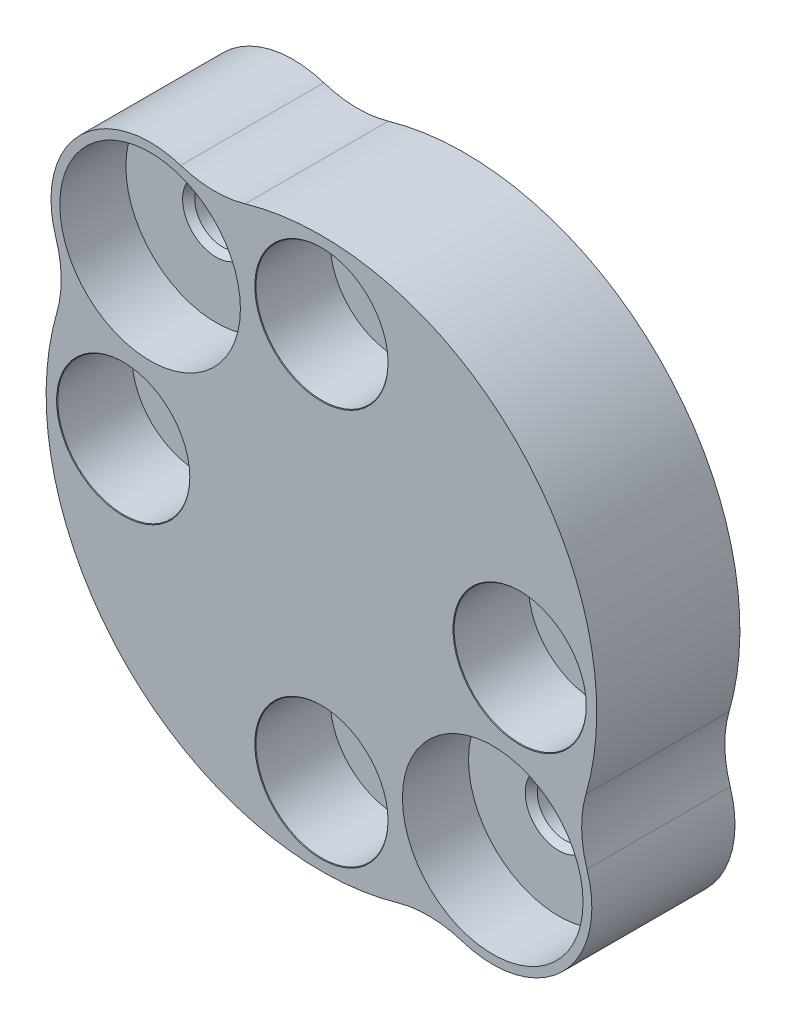
ISO-10303-21;
HEADER;
FILE_DESCRIPTION(('STEP AP214'),'2;1');
FILE_NAME('part.step','',(''),(''),'','','');
FILE_SCHEMA(('AUTOMOTIVE_DESIGN { 1 0 10303 214 1 1 1 1 }'));
ENDSEC;
DATA;
#1=APPLICATION_CONTEXT('core data for automotive mechanical design processes');
#2=APPLICATION_PROTOCOL_DEFINITION('international standard','automotive_design',2000,#1);
#3=PRODUCT_CONTEXT('',#1,'mechanical');
#4=PRODUCT('Part','Part','',(#3));
#5=PRODUCT_RELATED_PRODUCT_CATEGORY('part','',(#4));
#6=PRODUCT_DEFINITION_FORMATION('','',#4);
#7=PRODUCT_DEFINITION_CONTEXT('part definition',#1,'design');
#8=PRODUCT_DEFINITION('design','',#6,#7);
#9=PRODUCT_DEFINITION_SHAPE('','',#8);
#10=(LENGTH_UNIT() NAMED_UNIT(*) SI_UNIT(.MILLI.,.METRE.));
#11=(NAMED_UNIT(*) PLANE_ANGLE_UNIT() SI_UNIT($,.RADIAN.));
#12=(NAMED_UNIT(*) SI_UNIT($,.STERADIAN.) SOLID_ANGLE_UNIT());
#13=UNCERTAINTY_MEASURE_WITH_UNIT(LENGTH_MEASURE(1.E-05),#10,'distance_accuracy_value','');
#14=(GEOMETRIC_REPRESENTATION_CONTEXT(3) GLOBAL_UNCERTAINTY_ASSIGNED_CONTEXT((#13)) GLOBAL_UNIT_ASSIGNED_CONTEXT((#10,
#11,#12)) REPRESENTATION_CONTEXT('',''));
#15=CARTESIAN_POINT('',(0.,0.,0.));
#16=DIRECTION('',(0.,0.,1.));
#17=DIRECTION('',(1.,0.,0.));
#18=AXIS2_PLACEMENT_3D('',#15,#16,#17);
#19=CARTESIAN_POINT('',(0.,0.,6.5));
#20=DIRECTION('',(0.,0.,-1.));
#21=DIRECTION('',(-1.,0.,0.));
#22=AXIS2_PLACEMENT_3D('',#19,#20,#21);
#23=CYLINDRICAL_SURFACE('',#22,12.5);
#24=CARTESIAN_POINT('',(0.,0.,0.));
#25=DIRECTION('',(0.,0.,1.));
#26=DIRECTION('',(1.,0.,0.));
#27=AXIS2_PLACEMENT_3D('',#24,#25,#26);
#28=CIRCLE('',#27,12.5);
#29=CARTESIAN_POINT('',(-12.0107417738669,3.4629585676828,0.));
#30=VERTEX_POINT('',#29);
#31=CARTESIAN_POINT('',(3.46295856768293,-12.0107417738669,0.));
#32=VERTEX_POINT('',#31);
#33=EDGE_CURVE('E130',#30,#32,#28,.T.);
#34=ORIENTED_EDGE('',*,*,#33,.T.);
#35=DIRECTION('',(0.,0.,-1.));
#36=VECTOR('',#35,1.);
#37=CARTESIAN_POINT('',(3.46295856768293,-12.0107417738669,6.5));
#38=LINE('',#37,#36);
#39=CARTESIAN_POINT('',(3.46295856768293,-12.0107417738669,6.5));
#40=VERTEX_POINT('',#39);
#41=EDGE_CURVE('E149',#32,#40,#38,.F.);
#42=ORIENTED_EDGE('',*,*,#41,.T.);
#43=CARTESIAN_POINT('',(0.,0.,6.5));
#44=DIRECTION('',(0.,0.,1.));
#45=DIRECTION('',(1.,0.,0.));
#46=AXIS2_PLACEMENT_3D('',#43,#44,#45);
#47=CIRCLE('',#46,12.5);
#48=CARTESIAN_POINT('',(-12.0107417738669,3.4629585676828,6.5));
#49=VERTEX_POINT('',#48);
#50=EDGE_CURVE('E129',#49,#40,#47,.T.);
#51=ORIENTED_EDGE('',*,*,#50,.F.);
#52=DIRECTION('',(0.,0.,-1.));
#53=VECTOR('',#52,1.);
#54=CARTESIAN_POINT('',(-12.0107417738669,3.4629585676828,6.5));
#55=LINE('',#54,#53);
#56=EDGE_CURVE('E145',#49,#30,#55,.T.);
#57=ORIENTED_EDGE('',*,*,#56,.T.);
#58=EDGE_LOOP('',(#34,#42,#51,#57));
#59=FACE_BOUND('',#58,.T.);
#60=ADVANCED_FACE('F40',(#59),#23,.T.);
#61=CARTESIAN_POINT('',(12.0107417738669,-3.4629585676828,6.5));
#62=VERTEX_POINT('',#61);
#63=CARTESIAN_POINT('',(-3.46295856768293,12.0107417738669,6.5));
#64=VERTEX_POINT('',#63);
#65=EDGE_CURVE('E109',#62,#64,#47,.T.);
#66=ORIENTED_EDGE('',*,*,#65,.F.);
#67=DIRECTION('',(0.,0.,-1.));
#68=VECTOR('',#67,1.);
#69=CARTESIAN_POINT('',(12.0107417738669,-3.4629585676828,6.5));
#70=LINE('',#69,#68);
#71=CARTESIAN_POINT('',(12.0107417738669,-3.4629585676828,0.));
#72=VERTEX_POINT('',#71);
#73=EDGE_CURVE('E124',#62,#72,#70,.T.);
#74=ORIENTED_EDGE('',*,*,#73,.T.);
#75=CARTESIAN_POINT('',(-3.46295856768293,12.0107417738669,0.));
#76=VERTEX_POINT('',#75);
#77=EDGE_CURVE('E195',#72,#76,#28,.T.);
#78=ORIENTED_EDGE('',*,*,#77,.T.);
#79=DIRECTION('',(0.,0.,-1.));
#80=VECTOR('',#79,1.);
#81=CARTESIAN_POINT('',(-3.46295856768293,12.0107417738669,6.5));
#82=LINE('',#81,#80);
#83=EDGE_CURVE('E127',#76,#64,#82,.F.);
#84=ORIENTED_EDGE('',*,*,#83,.T.);
#85=EDGE_LOOP('',(#66,#74,#78,#84));
#86=FACE_BOUND('',#85,.T.);
#87=ADVANCED_FACE('F122',(#86),#23,.T.);
#88=CARTESIAN_POINT('',(0.,0.,6.5));
#89=DIRECTION('',(0.,0.,1.));
#90=DIRECTION('',(1.,0.,0.));
#91=AXIS2_PLACEMENT_3D('',#88,#89,#90);
#92=PLANE('',#91);
#93=CARTESIAN_POINT('',(7.77817459305206,-7.77817459305198,6.5));
#94=DIRECTION('',(0.,0.,1.));
#95=DIRECTION('',(-1.,0.,0.));
#96=AXIS2_PLACEMENT_3D('',#93,#94,#95);
#97=CIRCLE('',#96,4.1);
#98=CARTESIAN_POINT('',(3.67817459305207,-7.77817459305198,6.5));
#99=VERTEX_POINT('',#98);
#100=EDGE_CURVE('E295',#99,#99,#97,.T.);
#101=ORIENTED_EDGE('',*,*,#100,.F.);
#102=EDGE_LOOP('',(#101));
#103=FACE_BOUND('',#102,.T.);
#104=CARTESIAN_POINT('',(-7.77817459305206,7.77817459305198,6.5));
#105=DIRECTION('',(0.,0.,1.));
#106=DIRECTION('',(1.,0.,0.));
#107=AXIS2_PLACEMENT_3D('',#104,#105,#106);
#108=CIRCLE('',#107,4.5);
#109=CARTESIAN_POINT('',(-6.39026441491187,12.0587943305917,6.5));
#110=VERTEX_POINT('',#109);
#111=CARTESIAN_POINT('',(-12.0587943305918,6.39026441491174,6.5));
#112=VERTEX_POINT('',#111);
#113=EDGE_CURVE('E183',#110,#112,#108,.T.);
#114=ORIENTED_EDGE('',*,*,#113,.T.);
#115=CARTESIAN_POINT('',(-16.8150384834137,4.84814199475592,6.5));
#116=DIRECTION('',(0.,0.,1.));
#117=DIRECTION('',(1.,0.,0.));
#118=AXIS2_PLACEMENT_3D('',#115,#116,#117);
#119=CIRCLE('',#118,5.);
#120=EDGE_CURVE('E11',#112,#49,#119,.F.);
#121=ORIENTED_EDGE('',*,*,#120,.T.);
#122=ORIENTED_EDGE('',*,*,#50,.T.);
#123=CARTESIAN_POINT('',(4.8481419947561,-16.8150384834137,6.5));
#124=DIRECTION('',(0.,0.,1.));
#125=DIRECTION('',(1.,0.,0.));
#126=AXIS2_PLACEMENT_3D('',#123,#124,#125);
#127=CIRCLE('',#126,5.);
#128=CARTESIAN_POINT('',(6.39026441491187,-12.0587943305917,6.5));
#129=VERTEX_POINT('',#128);
#130=EDGE_CURVE('E116',#40,#129,#127,.F.);
#131=ORIENTED_EDGE('',*,*,#130,.T.);
#132=CARTESIAN_POINT('',(7.77817459305206,-7.77817459305198,6.5));
#133=DIRECTION('',(0.,0.,1.));
#134=DIRECTION('',(-1.,0.,0.));
#135=AXIS2_PLACEMENT_3D('',#132,#133,#134);
#136=CIRCLE('',#135,4.5);
#137=CARTESIAN_POINT('',(12.0587943305918,-6.39026441491174,6.5));
#138=VERTEX_POINT('',#137);
#139=EDGE_CURVE('E111',#129,#138,#136,.T.);
#140=ORIENTED_EDGE('',*,*,#139,.T.);
#141=CARTESIAN_POINT('',(16.8150384834137,-4.84814199475592,6.5));
#142=DIRECTION('',(0.,0.,1.));
#143=DIRECTION('',(1.,0.,0.));
#144=AXIS2_PLACEMENT_3D('',#141,#142,#143);
#145=CIRCLE('',#144,5.);
#146=EDGE_CURVE('E105',#138,#62,#145,.F.);
#147=ORIENTED_EDGE('',*,*,#146,.T.);
#148=ORIENTED_EDGE('',*,*,#65,.T.);
#149=CARTESIAN_POINT('',(-4.8481419947561,16.8150384834137,6.5));
#150=DIRECTION('',(0.,0.,1.));
#151=DIRECTION('',(1.,0.,0.));
#152=AXIS2_PLACEMENT_3D('',#149,#150,#151);
#153=CIRCLE('',#152,5.);
#154=EDGE_CURVE('E63',#64,#110,#153,.F.);
#155=ORIENTED_EDGE('',*,*,#154,.T.);
#156=EDGE_LOOP('',(#114,#121,#122,#131,#140,#147,#148,#155));
#157=FACE_BOUND('',#156,.T.);
#158=CARTESIAN_POINT('',(-7.77817459305206,7.77817459305198,6.5));
#159=DIRECTION('',(0.,0.,1.));
#160=DIRECTION('',(1.,0.,0.));
#161=AXIS2_PLACEMENT_3D('',#158,#159,#160);
#162=CIRCLE('',#161,4.1);
#163=CARTESIAN_POINT('',(-3.67817459305207,7.77817459305198,6.5));
#164=VERTEX_POINT('',#163);
#165=EDGE_CURVE('E281',#164,#164,#162,.T.);
#166=ORIENTED_EDGE('',*,*,#165,.F.);
#167=EDGE_LOOP('',(#166));
#168=FACE_BOUND('',#167,.T.);
#169=CARTESIAN_POINT('',(0.,-9.,6.5));
#170=DIRECTION('',(0.,0.,1.));
#171=DIRECTION('',(1.,0.,0.));
#172=AXIS2_PLACEMENT_3D('',#169,#170,#171);
#173=CIRCLE('',#172,3.025);
#174=CARTESIAN_POINT('',(3.02499999999991,-9.,6.5));
#175=VERTEX_POINT('',#174);
#176=EDGE_CURVE('E182',#175,#175,#173,.T.);
#177=ORIENTED_EDGE('',*,*,#176,.F.);
#178=EDGE_LOOP('',(#177));
#179=FACE_BOUND('',#178,.T.);
#180=CARTESIAN_POINT('',(9.,0.,6.5));
#181=DIRECTION('',(0.,0.,1.));
#182=DIRECTION('',(1.,0.,0.));
#183=AXIS2_PLACEMENT_3D('',#180,#181,#182);
#184=CIRCLE('',#183,3.025);
#185=CARTESIAN_POINT('',(12.025,0.,6.5));
#186=VERTEX_POINT('',#185);
#187=EDGE_CURVE('E255',#186,#186,#184,.T.);
#188=ORIENTED_EDGE('',*,*,#187,.F.);
#189=EDGE_LOOP('',(#188));
#190=FACE_BOUND('',#189,.T.);
#191=CARTESIAN_POINT('',(0.,9.,6.5));
#192=DIRECTION('',(0.,0.,1.));
#193=DIRECTION('',(1.,0.,0.));
#194=AXIS2_PLACEMENT_3D('',#191,#192,#193);
#195=CIRCLE('',#194,3.025);
#196=CARTESIAN_POINT('',(3.02500000000003,9.,6.5));
#197=VERTEX_POINT('',#196);
#198=EDGE_CURVE('E235',#197,#197,#195,.T.);
#199=ORIENTED_EDGE('',*,*,#198,.F.);
#200=EDGE_LOOP('',(#199));
#201=FACE_BOUND('',#200,.T.);
#202=CARTESIAN_POINT('',(-9.,0.,6.5));
#203=DIRECTION('',(0.,0.,1.));
#204=DIRECTION('',(1.,0.,0.));
#205=AXIS2_PLACEMENT_3D('',#202,#203,#204);
#206=CIRCLE('',#205,3.025);
#207=CARTESIAN_POINT('',(-5.975,0.,6.5));
#208=VERTEX_POINT('',#207);
#209=EDGE_CURVE('E215',#208,#208,#206,.T.);
#210=ORIENTED_EDGE('',*,*,#209,.F.);
#211=EDGE_LOOP('',(#210));
#212=FACE_BOUND('',#211,.T.);
#213=ADVANCED_FACE('F107',(#103,#157,#168,#179,#190,#201,#212),#92,.T.);
#214=CARTESIAN_POINT('',(0.,0.,0.));
#215=DIRECTION('',(0.,0.,1.));
#216=DIRECTION('',(1.,0.,0.));
#217=AXIS2_PLACEMENT_3D('',#214,#215,#216);
#218=PLANE('',#217);
#219=CARTESIAN_POINT('',(-7.77817459305206,7.77817459305198,0.));
#220=DIRECTION('',(0.,0.,1.));
#221=DIRECTION('',(1.,0.,0.));
#222=AXIS2_PLACEMENT_3D('',#219,#220,#221);
#223=CIRCLE('',#222,1.24999999999999);
#224=CARTESIAN_POINT('',(-6.52817459305208,7.77817459305198,0.));
#225=VERTEX_POINT('',#224);
#226=EDGE_CURVE('E314',#225,#225,#223,.T.);
#227=ORIENTED_EDGE('',*,*,#226,.T.);
#228=EDGE_LOOP('',(#227));
#229=FACE_BOUND('',#228,.T.);
#230=CARTESIAN_POINT('',(7.77817459305206,-7.77817459305198,0.));
#231=DIRECTION('',(0.,0.,1.));
#232=DIRECTION('',(1.,0.,0.));
#233=AXIS2_PLACEMENT_3D('',#230,#231,#232);
#234=CIRCLE('',#233,1.24999999999999);
#235=CARTESIAN_POINT('',(9.02817459305205,-7.77817459305198,0.));
#236=VERTEX_POINT('',#235);
#237=EDGE_CURVE('E299',#236,#236,#234,.T.);
#238=ORIENTED_EDGE('',*,*,#237,.T.);
#239=EDGE_LOOP('',(#238));
#240=FACE_BOUND('',#239,.T.);
#241=CARTESIAN_POINT('',(0.,-9.,0.));
#242=DIRECTION('',(0.,0.,1.));
#243=DIRECTION('',(1.,0.,0.));
#244=AXIS2_PLACEMENT_3D('',#241,#242,#243);
#245=CIRCLE('',#244,1.6);
#246=CARTESIAN_POINT('',(1.5999999999999,-9.,0.));
#247=VERTEX_POINT('',#246);
#248=EDGE_CURVE('E259',#247,#247,#245,.T.);
#249=ORIENTED_EDGE('',*,*,#248,.T.);
#250=EDGE_LOOP('',(#249));
#251=FACE_BOUND('',#250,.T.);
#252=CARTESIAN_POINT('',(9.,0.,0.));
#253=DIRECTION('',(0.,0.,1.));
#254=DIRECTION('',(1.,0.,0.));
#255=AXIS2_PLACEMENT_3D('',#252,#253,#254);
#256=CIRCLE('',#255,1.6);
#257=CARTESIAN_POINT('',(10.6,0.,0.));
#258=VERTEX_POINT('',#257);
#259=EDGE_CURVE('E239',#258,#258,#256,.T.);
#260=ORIENTED_EDGE('',*,*,#259,.T.);
#261=EDGE_LOOP('',(#260));
#262=FACE_BOUND('',#261,.T.);
#263=CARTESIAN_POINT('',(0.,9.,0.));
#264=DIRECTION('',(0.,0.,1.));
#265=DIRECTION('',(1.,0.,0.));
#266=AXIS2_PLACEMENT_3D('',#263,#264,#265);
#267=CIRCLE('',#266,1.6);
#268=CARTESIAN_POINT('',(1.60000000000003,9.,0.));
#269=VERTEX_POINT('',#268);
#270=EDGE_CURVE('E219',#269,#269,#267,.T.);
#271=ORIENTED_EDGE('',*,*,#270,.T.);
#272=EDGE_LOOP('',(#271));
#273=FACE_BOUND('',#272,.T.);
#274=CARTESIAN_POINT('',(-9.,0.,0.));
#275=DIRECTION('',(0.,0.,1.));
#276=DIRECTION('',(1.,0.,0.));
#277=AXIS2_PLACEMENT_3D('',#274,#275,#276);
#278=CIRCLE('',#277,1.6);
#279=CARTESIAN_POINT('',(-7.4,0.,0.));
#280=VERTEX_POINT('',#279);
#281=EDGE_CURVE('E192',#280,#280,#278,.T.);
#282=ORIENTED_EDGE('',*,*,#281,.T.);
#283=EDGE_LOOP('',(#282));
#284=FACE_BOUND('',#283,.T.);
#285=ORIENTED_EDGE('',*,*,#77,.F.);
#286=CARTESIAN_POINT('',(16.8150384834137,-4.84814199475592,0.));
#287=DIRECTION('',(0.,0.,1.));
#288=DIRECTION('',(1.,0.,0.));
#289=AXIS2_PLACEMENT_3D('',#286,#287,#288);
#290=CIRCLE('',#289,5.);
#291=CARTESIAN_POINT('',(12.0587943305918,-6.39026441491174,0.));
#292=VERTEX_POINT('',#291);
#293=EDGE_CURVE('E117',#72,#292,#290,.T.);
#294=ORIENTED_EDGE('',*,*,#293,.T.);
#295=CARTESIAN_POINT('',(7.77817459305206,-7.77817459305198,0.));
#296=DIRECTION('',(0.,0.,1.));
#297=DIRECTION('',(1.,0.,0.));
#298=AXIS2_PLACEMENT_3D('',#295,#296,#297);
#299=CIRCLE('',#298,4.5);
#300=CARTESIAN_POINT('',(6.39026441491187,-12.0587943305917,0.));
#301=VERTEX_POINT('',#300);
#302=EDGE_CURVE('E285',#292,#301,#299,.F.);
#303=ORIENTED_EDGE('',*,*,#302,.T.);
#304=CARTESIAN_POINT('',(4.8481419947561,-16.8150384834137,0.));
#305=DIRECTION('',(0.,0.,1.));
#306=DIRECTION('',(1.,0.,0.));
#307=AXIS2_PLACEMENT_3D('',#304,#305,#306);
#308=CIRCLE('',#307,5.);
#309=EDGE_CURVE('E162',#301,#32,#308,.T.);
#310=ORIENTED_EDGE('',*,*,#309,.T.);
#311=ORIENTED_EDGE('',*,*,#33,.F.);
#312=CARTESIAN_POINT('',(-16.8150384834137,4.84814199475592,0.));
#313=DIRECTION('',(0.,0.,1.));
#314=DIRECTION('',(1.,0.,0.));
#315=AXIS2_PLACEMENT_3D('',#312,#313,#314);
#316=CIRCLE('',#315,5.);
#317=CARTESIAN_POINT('',(-12.0587943305918,6.39026441491174,0.));
#318=VERTEX_POINT('',#317);
#319=EDGE_CURVE('E49',#30,#318,#316,.T.);
#320=ORIENTED_EDGE('',*,*,#319,.T.);
#321=CARTESIAN_POINT('',(-7.77817459305206,7.77817459305198,0.));
#322=DIRECTION('',(0.,0.,1.));
#323=DIRECTION('',(1.,0.,0.));
#324=AXIS2_PLACEMENT_3D('',#321,#322,#323);
#325=CIRCLE('',#324,4.5);
#326=CARTESIAN_POINT('',(-6.39026441491187,12.0587943305917,0.));
#327=VERTEX_POINT('',#326);
#328=EDGE_CURVE('E174',#318,#327,#325,.F.);
#329=ORIENTED_EDGE('',*,*,#328,.T.);
#330=CARTESIAN_POINT('',(-4.8481419947561,16.8150384834137,0.));
#331=DIRECTION('',(0.,0.,1.));
#332=DIRECTION('',(1.,0.,0.));
#333=AXIS2_PLACEMENT_3D('',#330,#331,#332);
#334=CIRCLE('',#333,5.);
#335=EDGE_CURVE('E167',#327,#76,#334,.T.);
#336=ORIENTED_EDGE('',*,*,#335,.T.);
#337=EDGE_LOOP('',(#285,#294,#303,#310,#311,#320,#329,#336));
#338=FACE_BOUND('',#337,.T.);
#339=ADVANCED_FACE('F173',(#229,#240,#251,#262,#273,#284,#338),#218,.F.);
#340=CARTESIAN_POINT('',(-9.,0.,6.5));
#341=DIRECTION('',(0.,0.,1.));
#342=DIRECTION('',(1.,0.,0.));
#343=AXIS2_PLACEMENT_3D('',#340,#341,#342);
#344=CYLINDRICAL_SURFACE('',#343,1.6);
#345=ORIENTED_EDGE('',*,*,#281,.F.);
#346=EDGE_LOOP('',(#345));
#347=FACE_BOUND('',#346,.T.);
#348=CARTESIAN_POINT('',(-9.,0.,3.1));
#349=DIRECTION('',(0.,0.,1.));
#350=DIRECTION('',(1.,0.,0.));
#351=AXIS2_PLACEMENT_3D('',#348,#349,#350);
#352=CIRCLE('',#351,1.6);
#353=CARTESIAN_POINT('',(-7.4,0.,3.1));
#354=VERTEX_POINT('',#353);
#355=EDGE_CURVE('E199',#354,#354,#352,.T.);
#356=ORIENTED_EDGE('',*,*,#355,.T.);
#357=EDGE_LOOP('',(#356));
#358=FACE_BOUND('',#357,.T.);
#359=ADVANCED_FACE('F577',(#347,#358),#344,.F.);
#360=CARTESIAN_POINT('',(-6.,0.,3.1));
#361=DIRECTION('',(0.,0.,-1.));
#362=DIRECTION('',(-1.,0.,0.));
#363=AXIS2_PLACEMENT_3D('',#360,#361,#362);
#364=PLANE('',#363);
#365=ORIENTED_EDGE('',*,*,#355,.F.);
#366=EDGE_LOOP('',(#365));
#367=FACE_BOUND('',#366,.T.);
#368=CARTESIAN_POINT('',(-9.,0.,3.1));
#369=DIRECTION('',(0.,0.,1.));
#370=DIRECTION('',(1.,0.,0.));
#371=AXIS2_PLACEMENT_3D('',#368,#369,#370);
#372=CIRCLE('',#371,3.);
#373=CARTESIAN_POINT('',(-6.,0.,3.1));
#374=VERTEX_POINT('',#373);
#375=EDGE_CURVE('E204',#374,#374,#372,.T.);
#376=ORIENTED_EDGE('',*,*,#375,.T.);
#377=EDGE_LOOP('',(#376));
#378=FACE_BOUND('',#377,.T.);
#379=ADVANCED_FACE('F366',(#367,#378),#364,.F.);
#380=CARTESIAN_POINT('',(-9.,0.,6.5));
#381=DIRECTION('',(0.,0.,1.));
#382=DIRECTION('',(1.,0.,0.));
#383=AXIS2_PLACEMENT_3D('',#380,#381,#382);
#384=CYLINDRICAL_SURFACE('',#383,3.);
#385=ORIENTED_EDGE('',*,*,#375,.F.);
#386=EDGE_LOOP('',(#385));
#387=FACE_BOUND('',#386,.T.);
#388=CARTESIAN_POINT('',(-9.,0.,6.475));
#389=DIRECTION('',(0.,0.,1.));
#390=DIRECTION('',(1.,0.,0.));
#391=AXIS2_PLACEMENT_3D('',#388,#389,#390);
#392=CIRCLE('',#391,3.);
#393=CARTESIAN_POINT('',(-6.,0.,6.475));
#394=VERTEX_POINT('',#393);
#395=EDGE_CURVE('E209',#394,#394,#392,.T.);
#396=ORIENTED_EDGE('',*,*,#395,.T.);
#397=EDGE_LOOP('',(#396));
#398=FACE_BOUND('',#397,.T.);
#399=ADVANCED_FACE('F356',(#387,#398),#384,.F.);
#400=CARTESIAN_POINT('',(-9.,0.,6.5));
#401=DIRECTION('',(0.,0.,1.));
#402=DIRECTION('',(1.,0.,0.));
#403=AXIS2_PLACEMENT_3D('',#400,#401,#402);
#404=CONICAL_SURFACE('',#403,3.025,0.785398163397396);
#405=ORIENTED_EDGE('',*,*,#395,.F.);
#406=EDGE_LOOP('',(#405));
#407=FACE_BOUND('',#406,.T.);
#408=ORIENTED_EDGE('',*,*,#209,.T.);
#409=EDGE_LOOP('',(#408));
#410=FACE_BOUND('',#409,.T.);
#411=ADVANCED_FACE('F353',(#407,#410),#404,.F.);
#412=CARTESIAN_POINT('',(0.,9.,6.5));
#413=DIRECTION('',(0.,0.,1.));
#414=DIRECTION('',(1.,0.,0.));
#415=AXIS2_PLACEMENT_3D('',#412,#413,#414);
#416=CYLINDRICAL_SURFACE('',#415,1.6);
#417=ORIENTED_EDGE('',*,*,#270,.F.);
#418=EDGE_LOOP('',(#417));
#419=FACE_BOUND('',#418,.T.);
#420=CARTESIAN_POINT('',(0.,9.,3.1));
#421=DIRECTION('',(0.,0.,1.));
#422=DIRECTION('',(1.,0.,0.));
#423=AXIS2_PLACEMENT_3D('',#420,#421,#422);
#424=CIRCLE('',#423,1.6);
#425=CARTESIAN_POINT('',(1.60000000000003,9.,3.1));
#426=VERTEX_POINT('',#425);
#427=EDGE_CURVE('E223',#426,#426,#424,.T.);
#428=ORIENTED_EDGE('',*,*,#427,.T.);
#429=EDGE_LOOP('',(#428));
#430=FACE_BOUND('',#429,.T.);
#431=ADVANCED_FACE('F355',(#419,#430),#416,.F.);
#432=CARTESIAN_POINT('',(3.00000000000003,9.,3.1));
#433=DIRECTION('',(0.,0.,-1.));
#434=DIRECTION('',(-1.,0.,0.));
#435=AXIS2_PLACEMENT_3D('',#432,#433,#434);
#436=PLANE('',#435);
#437=ORIENTED_EDGE('',*,*,#427,.F.);
#438=EDGE_LOOP('',(#437));
#439=FACE_BOUND('',#438,.T.);
#440=CARTESIAN_POINT('',(0.,9.,3.1));
#441=DIRECTION('',(0.,0.,1.));
#442=DIRECTION('',(1.,0.,0.));
#443=AXIS2_PLACEMENT_3D('',#440,#441,#442);
#444=CIRCLE('',#443,3.);
#445=CARTESIAN_POINT('',(3.00000000000003,9.,3.1));
#446=VERTEX_POINT('',#445);
#447=EDGE_CURVE('E227',#446,#446,#444,.T.);
#448=ORIENTED_EDGE('',*,*,#447,.T.);
#449=EDGE_LOOP('',(#448));
#450=FACE_BOUND('',#449,.T.);
#451=ADVANCED_FACE('F363',(#439,#450),#436,.F.);
#452=CARTESIAN_POINT('',(0.,9.,6.5));
#453=DIRECTION('',(0.,0.,1.));
#454=DIRECTION('',(1.,0.,0.));
#455=AXIS2_PLACEMENT_3D('',#452,#453,#454);
#456=CYLINDRICAL_SURFACE('',#455,3.);
#457=ORIENTED_EDGE('',*,*,#447,.F.);
#458=EDGE_LOOP('',(#457));
#459=FACE_BOUND('',#458,.T.);
#460=CARTESIAN_POINT('',(0.,9.,6.475));
#461=DIRECTION('',(0.,0.,1.));
#462=DIRECTION('',(1.,0.,0.));
#463=AXIS2_PLACEMENT_3D('',#460,#461,#462);
#464=CIRCLE('',#463,3.);
#465=CARTESIAN_POINT('',(3.00000000000003,9.,6.475));
#466=VERTEX_POINT('',#465);
#467=EDGE_CURVE('E231',#466,#466,#464,.T.);
#468=ORIENTED_EDGE('',*,*,#467,.T.);
#469=EDGE_LOOP('',(#468));
#470=FACE_BOUND('',#469,.T.);
#471=ADVANCED_FACE('F441',(#459,#470),#456,.F.);
#472=CARTESIAN_POINT('',(0.,9.,6.5));
#473=DIRECTION('',(0.,0.,1.));
#474=DIRECTION('',(1.,0.,0.));
#475=AXIS2_PLACEMENT_3D('',#472,#473,#474);
#476=CONICAL_SURFACE('',#475,3.025,0.785398163397396);
#477=ORIENTED_EDGE('',*,*,#467,.F.);
#478=EDGE_LOOP('',(#477));
#479=FACE_BOUND('',#478,.T.);
#480=ORIENTED_EDGE('',*,*,#198,.T.);
#481=EDGE_LOOP('',(#480));
#482=FACE_BOUND('',#481,.T.);
#483=ADVANCED_FACE('F437',(#479,#482),#476,.F.);
#484=CARTESIAN_POINT('',(9.,0.,6.5));
#485=DIRECTION('',(0.,0.,1.));
#486=DIRECTION('',(1.,0.,0.));
#487=AXIS2_PLACEMENT_3D('',#484,#485,#486);
#488=CYLINDRICAL_SURFACE('',#487,1.6);
#489=ORIENTED_EDGE('',*,*,#259,.F.);
#490=EDGE_LOOP('',(#489));
#491=FACE_BOUND('',#490,.T.);
#492=CARTESIAN_POINT('',(9.,0.,3.1));
#493=DIRECTION('',(0.,0.,1.));
#494=DIRECTION('',(1.,0.,0.));
#495=AXIS2_PLACEMENT_3D('',#492,#493,#494);
#496=CIRCLE('',#495,1.6);
#497=CARTESIAN_POINT('',(10.6,0.,3.1));
#498=VERTEX_POINT('',#497);
#499=EDGE_CURVE('E243',#498,#498,#496,.T.);
#500=ORIENTED_EDGE('',*,*,#499,.T.);
#501=EDGE_LOOP('',(#500));
#502=FACE_BOUND('',#501,.T.);
#503=ADVANCED_FACE('F433',(#491,#502),#488,.F.);
#504=CARTESIAN_POINT('',(12.,0.,3.1));
#505=DIRECTION('',(0.,0.,-1.));
#506=DIRECTION('',(-1.,0.,0.));
#507=AXIS2_PLACEMENT_3D('',#504,#505,#506);
#508=PLANE('',#507);
#509=ORIENTED_EDGE('',*,*,#499,.F.);
#510=EDGE_LOOP('',(#509));
#511=FACE_BOUND('',#510,.T.);
#512=CARTESIAN_POINT('',(9.,0.,3.1));
#513=DIRECTION('',(0.,0.,1.));
#514=DIRECTION('',(1.,0.,0.));
#515=AXIS2_PLACEMENT_3D('',#512,#513,#514);
#516=CIRCLE('',#515,3.);
#517=CARTESIAN_POINT('',(12.,0.,3.1));
#518=VERTEX_POINT('',#517);
#519=EDGE_CURVE('E247',#518,#518,#516,.T.);
#520=ORIENTED_EDGE('',*,*,#519,.T.);
#521=EDGE_LOOP('',(#520));
#522=FACE_BOUND('',#521,.T.);
#523=ADVANCED_FACE('F429',(#511,#522),#508,.F.);
#524=CARTESIAN_POINT('',(9.,0.,6.5));
#525=DIRECTION('',(0.,0.,1.));
#526=DIRECTION('',(1.,0.,0.));
#527=AXIS2_PLACEMENT_3D('',#524,#525,#526);
#528=CYLINDRICAL_SURFACE('',#527,3.);
#529=ORIENTED_EDGE('',*,*,#519,.F.);
#530=EDGE_LOOP('',(#529));
#531=FACE_BOUND('',#530,.T.);
#532=CARTESIAN_POINT('',(9.,0.,6.475));
#533=DIRECTION('',(0.,0.,1.));
#534=DIRECTION('',(1.,0.,0.));
#535=AXIS2_PLACEMENT_3D('',#532,#533,#534);
#536=CIRCLE('',#535,3.);
#537=CARTESIAN_POINT('',(12.,0.,6.475));
#538=VERTEX_POINT('',#537);
#539=EDGE_CURVE('E251',#538,#538,#536,.T.);
#540=ORIENTED_EDGE('',*,*,#539,.T.);
#541=EDGE_LOOP('',(#540));
#542=FACE_BOUND('',#541,.T.);
#543=ADVANCED_FACE('F425',(#531,#542),#528,.F.);
#544=CARTESIAN_POINT('',(9.,0.,6.5));
#545=DIRECTION('',(0.,0.,1.));
#546=DIRECTION('',(1.,0.,0.));
#547=AXIS2_PLACEMENT_3D('',#544,#545,#546);
#548=CONICAL_SURFACE('',#547,3.025,0.785398163397396);
#549=ORIENTED_EDGE('',*,*,#539,.F.);
#550=EDGE_LOOP('',(#549));
#551=FACE_BOUND('',#550,.T.);
#552=ORIENTED_EDGE('',*,*,#187,.T.);
#553=EDGE_LOOP('',(#552));
#554=FACE_BOUND('',#553,.T.);
#555=ADVANCED_FACE('F421',(#551,#554),#548,.F.);
#556=CARTESIAN_POINT('',(0.,-9.,6.5));
#557=DIRECTION('',(0.,0.,1.));
#558=DIRECTION('',(1.,0.,0.));
#559=AXIS2_PLACEMENT_3D('',#556,#557,#558);
#560=CYLINDRICAL_SURFACE('',#559,1.6);
#561=ORIENTED_EDGE('',*,*,#248,.F.);
#562=EDGE_LOOP('',(#561));
#563=FACE_BOUND('',#562,.T.);
#564=CARTESIAN_POINT('',(0.,-9.,3.1));
#565=DIRECTION('',(0.,0.,1.));
#566=DIRECTION('',(1.,0.,0.));
#567=AXIS2_PLACEMENT_3D('',#564,#565,#566);
#568=CIRCLE('',#567,1.6);
#569=CARTESIAN_POINT('',(1.59999999999991,-9.,3.1));
#570=VERTEX_POINT('',#569);
#571=EDGE_CURVE('E263',#570,#570,#568,.T.);
#572=ORIENTED_EDGE('',*,*,#571,.T.);
#573=EDGE_LOOP('',(#572));
#574=FACE_BOUND('',#573,.T.);
#575=ADVANCED_FACE('F417',(#563,#574),#560,.F.);
#576=CARTESIAN_POINT('',(2.9999999999999,-9.,3.1));
#577=DIRECTION('',(0.,0.,-1.));
#578=DIRECTION('',(-1.,0.,0.));
#579=AXIS2_PLACEMENT_3D('',#576,#577,#578);
#580=PLANE('',#579);
#581=ORIENTED_EDGE('',*,*,#571,.F.);
#582=EDGE_LOOP('',(#581));
#583=FACE_BOUND('',#582,.T.);
#584=CARTESIAN_POINT('',(0.,-9.,3.1));
#585=DIRECTION('',(0.,0.,1.));
#586=DIRECTION('',(1.,0.,0.));
#587=AXIS2_PLACEMENT_3D('',#584,#585,#586);
#588=CIRCLE('',#587,3.);
#589=CARTESIAN_POINT('',(2.9999999999999,-9.,3.1));
#590=VERTEX_POINT('',#589);
#591=EDGE_CURVE('E267',#590,#590,#588,.T.);
#592=ORIENTED_EDGE('',*,*,#591,.T.);
#593=EDGE_LOOP('',(#592));
#594=FACE_BOUND('',#593,.T.);
#595=ADVANCED_FACE('F413',(#583,#594),#580,.F.);
#596=CARTESIAN_POINT('',(0.,-9.,6.5));
#597=DIRECTION('',(0.,0.,1.));
#598=DIRECTION('',(1.,0.,0.));
#599=AXIS2_PLACEMENT_3D('',#596,#597,#598);
#600=CYLINDRICAL_SURFACE('',#599,3.);
#601=ORIENTED_EDGE('',*,*,#591,.F.);
#602=EDGE_LOOP('',(#601));
#603=FACE_BOUND('',#602,.T.);
#604=CARTESIAN_POINT('',(0.,-9.,6.475));
#605=DIRECTION('',(0.,0.,1.));
#606=DIRECTION('',(1.,0.,0.));
#607=AXIS2_PLACEMENT_3D('',#604,#605,#606);
#608=CIRCLE('',#607,3.);
#609=CARTESIAN_POINT('',(2.9999999999999,-9.,6.475));
#610=VERTEX_POINT('',#609);
#611=EDGE_CURVE('E271',#610,#610,#608,.T.);
#612=ORIENTED_EDGE('',*,*,#611,.T.);
#613=EDGE_LOOP('',(#612));
#614=FACE_BOUND('',#613,.T.);
#615=ADVANCED_FACE('F409',(#603,#614),#600,.F.);
#616=CARTESIAN_POINT('',(0.,-9.,6.5));
#617=DIRECTION('',(0.,0.,1.));
#618=DIRECTION('',(1.,0.,0.));
#619=AXIS2_PLACEMENT_3D('',#616,#617,#618);
#620=CONICAL_SURFACE('',#619,3.025,0.785398163397396);
#621=ORIENTED_EDGE('',*,*,#611,.F.);
#622=EDGE_LOOP('',(#621));
#623=FACE_BOUND('',#622,.T.);
#624=ORIENTED_EDGE('',*,*,#176,.T.);
#625=EDGE_LOOP('',(#624));
#626=FACE_BOUND('',#625,.T.);
#627=ADVANCED_FACE('F406',(#623,#626),#620,.F.);
#628=CARTESIAN_POINT('',(-7.77817459305206,7.77817459305198,-12.7279220613579));
#629=DIRECTION('',(0.,0.,1.));
#630=DIRECTION('',(1.,0.,0.));
#631=AXIS2_PLACEMENT_3D('',#628,#629,#630);
#632=CYLINDRICAL_SURFACE('',#631,4.5);
#633=ORIENTED_EDGE('',*,*,#113,.F.);
#634=DIRECTION('',(0.,0.,1.));
#635=VECTOR('',#634,1.);
#636=CARTESIAN_POINT('',(-6.39026441491187,12.0587943305917,-12.7279220613579));
#637=LINE('',#636,#635);
#638=EDGE_CURVE('E155',#110,#327,#637,.F.);
#639=ORIENTED_EDGE('',*,*,#638,.T.);
#640=ORIENTED_EDGE('',*,*,#328,.F.);
#641=DIRECTION('',(0.,0.,1.));
#642=VECTOR('',#641,1.);
#643=CARTESIAN_POINT('',(-12.0587943305918,6.39026441491174,-12.7279220613579));
#644=LINE('',#643,#642);
#645=EDGE_CURVE('E56',#318,#112,#644,.T.);
#646=ORIENTED_EDGE('',*,*,#645,.T.);
#647=EDGE_LOOP('',(#633,#639,#640,#646));
#648=FACE_BOUND('',#647,.T.);
#649=ADVANCED_FACE('F179',(#648),#632,.T.);
#650=CARTESIAN_POINT('',(-7.77817459305206,7.77817459305198,3.5));
#651=DIRECTION('',(0.,0.,1.));
#652=DIRECTION('',(1.,0.,0.));
#653=AXIS2_PLACEMENT_3D('',#650,#651,#652);
#654=CYLINDRICAL_SURFACE('',#653,4.1);
#655=CARTESIAN_POINT('',(-7.77817459305206,7.77817459305198,3.5));
#656=DIRECTION('',(0.,0.,1.));
#657=DIRECTION('',(1.,0.,0.));
#658=AXIS2_PLACEMENT_3D('',#655,#656,#657);
#659=CIRCLE('',#658,4.1);
#660=CARTESIAN_POINT('',(-3.67817459305207,7.77817459305198,3.5));
#661=VERTEX_POINT('',#660);
#662=EDGE_CURVE('E280',#661,#661,#659,.T.);
#663=ORIENTED_EDGE('',*,*,#662,.F.);
#664=EDGE_LOOP('',(#663));
#665=FACE_BOUND('',#664,.T.);
#666=ORIENTED_EDGE('',*,*,#165,.T.);
#667=EDGE_LOOP('',(#666));
#668=FACE_BOUND('',#667,.T.);
#669=ADVANCED_FACE('F333',(#665,#668),#654,.F.);
#670=CARTESIAN_POINT('',(-7.77817459305206,7.77817459305198,3.5));
#671=DIRECTION('',(0.,0.,1.));
#672=DIRECTION('',(1.,0.,0.));
#673=AXIS2_PLACEMENT_3D('',#670,#671,#672);
#674=PLANE('',#673);
#675=CARTESIAN_POINT('',(-7.77817459305206,7.77817459305198,3.5));
#676=DIRECTION('',(0.,0.,1.));
#677=DIRECTION('',(1.,0.,0.));
#678=AXIS2_PLACEMENT_3D('',#675,#676,#677);
#679=CIRCLE('',#678,1.525);
#680=CARTESIAN_POINT('',(-6.25317459305206,7.77817459305198,3.5));
#681=VERTEX_POINT('',#680);
#682=EDGE_CURVE('E322',#681,#681,#679,.T.);
#683=ORIENTED_EDGE('',*,*,#682,.F.);
#684=EDGE_LOOP('',(#683));
#685=FACE_BOUND('',#684,.T.);
#686=ORIENTED_EDGE('',*,*,#662,.T.);
#687=EDGE_LOOP('',(#686));
#688=FACE_BOUND('',#687,.T.);
#689=ADVANCED_FACE('F329',(#685,#688),#674,.T.);
#690=CARTESIAN_POINT('',(7.77817459305206,-7.77817459305198,-12.7279220613579));
#691=DIRECTION('',(0.,0.,1.));
#692=DIRECTION('',(1.,0.,0.));
#693=AXIS2_PLACEMENT_3D('',#690,#691,#692);
#694=CYLINDRICAL_SURFACE('',#693,4.5);
#695=ORIENTED_EDGE('',*,*,#302,.F.);
#696=DIRECTION('',(0.,0.,1.));
#697=VECTOR('',#696,1.);
#698=CARTESIAN_POINT('',(12.0587943305918,-6.39026441491174,-12.7279220613579));
#699=LINE('',#698,#697);
#700=EDGE_CURVE('E138',#292,#138,#699,.T.);
#701=ORIENTED_EDGE('',*,*,#700,.T.);
#702=ORIENTED_EDGE('',*,*,#139,.F.);
#703=DIRECTION('',(0.,0.,1.));
#704=VECTOR('',#703,1.);
#705=CARTESIAN_POINT('',(6.39026441491187,-12.0587943305917,-12.7279220613579));
#706=LINE('',#705,#704);
#707=EDGE_CURVE('E134',#129,#301,#706,.F.);
#708=ORIENTED_EDGE('',*,*,#707,.T.);
#709=EDGE_LOOP('',(#695,#701,#702,#708));
#710=FACE_BOUND('',#709,.T.);
#711=ADVANCED_FACE('F332',(#710),#694,.T.);
#712=CARTESIAN_POINT('',(7.77817459305206,-7.77817459305198,3.5));
#713=DIRECTION('',(0.,0.,1.));
#714=DIRECTION('',(1.,0.,0.));
#715=AXIS2_PLACEMENT_3D('',#712,#713,#714);
#716=CYLINDRICAL_SURFACE('',#715,4.1);
#717=CARTESIAN_POINT('',(7.77817459305206,-7.77817459305198,3.5));
#718=DIRECTION('',(0.,0.,1.));
#719=DIRECTION('',(-1.,0.,0.));
#720=AXIS2_PLACEMENT_3D('',#717,#718,#719);
#721=CIRCLE('',#720,4.1);
#722=CARTESIAN_POINT('',(3.67817459305207,-7.77817459305198,3.5));
#723=VERTEX_POINT('',#722);
#724=EDGE_CURVE('E294',#723,#723,#721,.T.);
#725=ORIENTED_EDGE('',*,*,#724,.F.);
#726=EDGE_LOOP('',(#725));
#727=FACE_BOUND('',#726,.T.);
#728=ORIENTED_EDGE('',*,*,#100,.T.);
#729=EDGE_LOOP('',(#728));
#730=FACE_BOUND('',#729,.T.);
#731=ADVANCED_FACE('F395',(#727,#730),#716,.F.);
#732=CARTESIAN_POINT('',(7.77817459305206,-7.77817459305198,3.5));
#733=DIRECTION('',(0.,0.,1.));
#734=DIRECTION('',(-1.,0.,0.));
#735=AXIS2_PLACEMENT_3D('',#732,#733,#734);
#736=PLANE('',#735);
#737=CARTESIAN_POINT('',(7.77817459305206,-7.77817459305198,3.5));
#738=DIRECTION('',(0.,0.,1.));
#739=DIRECTION('',(1.,0.,0.));
#740=AXIS2_PLACEMENT_3D('',#737,#738,#739);
#741=CIRCLE('',#740,1.525);
#742=CARTESIAN_POINT('',(9.30317459305206,-7.77817459305198,3.5));
#743=VERTEX_POINT('',#742);
#744=EDGE_CURVE('E310',#743,#743,#741,.T.);
#745=ORIENTED_EDGE('',*,*,#744,.F.);
#746=EDGE_LOOP('',(#745));
#747=FACE_BOUND('',#746,.T.);
#748=ORIENTED_EDGE('',*,*,#724,.T.);
#749=EDGE_LOOP('',(#748));
#750=FACE_BOUND('',#749,.T.);
#751=ADVANCED_FACE('F380',(#747,#750),#736,.T.);
#752=CARTESIAN_POINT('',(16.8150384834137,-4.84814199475592,-12.7279220613579));
#753=DIRECTION('',(0.,0.,1.));
#754=DIRECTION('',(1.,0.,0.));
#755=AXIS2_PLACEMENT_3D('',#752,#753,#754);
#756=CYLINDRICAL_SURFACE('',#755,5.);
#757=ORIENTED_EDGE('',*,*,#146,.F.);
#758=ORIENTED_EDGE('',*,*,#700,.F.);
#759=ORIENTED_EDGE('',*,*,#293,.F.);
#760=ORIENTED_EDGE('',*,*,#73,.F.);
#761=EDGE_LOOP('',(#757,#758,#759,#760));
#762=FACE_BOUND('',#761,.T.);
#763=ADVANCED_FACE('F132',(#762),#756,.F.);
#764=CARTESIAN_POINT('',(4.8481419947561,-16.8150384834137,-12.7279220613579));
#765=DIRECTION('',(0.,0.,-1.));
#766=DIRECTION('',(-1.,0.,0.));
#767=AXIS2_PLACEMENT_3D('',#764,#765,#766);
#768=CYLINDRICAL_SURFACE('',#767,5.);
#769=ORIENTED_EDGE('',*,*,#309,.F.);
#770=ORIENTED_EDGE('',*,*,#707,.F.);
#771=ORIENTED_EDGE('',*,*,#130,.F.);
#772=ORIENTED_EDGE('',*,*,#41,.F.);
#773=EDGE_LOOP('',(#769,#770,#771,#772));
#774=FACE_BOUND('',#773,.T.);
#775=ADVANCED_FACE('F379',(#774),#768,.F.);
#776=CARTESIAN_POINT('',(-4.8481419947561,16.8150384834137,-12.7279220613579));
#777=DIRECTION('',(0.,0.,-1.));
#778=DIRECTION('',(-1.,0.,0.));
#779=AXIS2_PLACEMENT_3D('',#776,#777,#778);
#780=CYLINDRICAL_SURFACE('',#779,5.);
#781=ORIENTED_EDGE('',*,*,#335,.F.);
#782=ORIENTED_EDGE('',*,*,#638,.F.);
#783=ORIENTED_EDGE('',*,*,#154,.F.);
#784=ORIENTED_EDGE('',*,*,#83,.F.);
#785=EDGE_LOOP('',(#781,#782,#783,#784));
#786=FACE_BOUND('',#785,.T.);
#787=ADVANCED_FACE('F382',(#786),#780,.F.);
#788=CARTESIAN_POINT('',(-16.8150384834137,4.84814199475592,-12.7279220613579));
#789=DIRECTION('',(0.,0.,1.));
#790=DIRECTION('',(1.,0.,0.));
#791=AXIS2_PLACEMENT_3D('',#788,#789,#790);
#792=CYLINDRICAL_SURFACE('',#791,5.);
#793=ORIENTED_EDGE('',*,*,#120,.F.);
#794=ORIENTED_EDGE('',*,*,#645,.F.);
#795=ORIENTED_EDGE('',*,*,#319,.F.);
#796=ORIENTED_EDGE('',*,*,#56,.F.);
#797=EDGE_LOOP('',(#793,#794,#795,#796));
#798=FACE_BOUND('',#797,.T.);
#799=ADVANCED_FACE('F42',(#798),#792,.F.);
#800=CARTESIAN_POINT('',(7.77817459305206,-7.77817459305198,3.5));
#801=DIRECTION('',(0.,0.,1.));
#802=DIRECTION('',(1.,0.,0.));
#803=AXIS2_PLACEMENT_3D('',#800,#801,#802);
#804=CYLINDRICAL_SURFACE('',#803,1.24999999999999);
#805=ORIENTED_EDGE('',*,*,#237,.F.);
#806=EDGE_LOOP('',(#805));
#807=FACE_BOUND('',#806,.T.);
#808=CARTESIAN_POINT('',(7.77817459305206,-7.77817459305198,3.225));
#809=DIRECTION('',(0.,0.,1.));
#810=DIRECTION('',(1.,0.,0.));
#811=AXIS2_PLACEMENT_3D('',#808,#809,#810);
#812=CIRCLE('',#811,1.25);
#813=CARTESIAN_POINT('',(9.02817459305206,-7.77817459305198,3.225));
#814=VERTEX_POINT('',#813);
#815=EDGE_CURVE('E306',#814,#814,#812,.T.);
#816=ORIENTED_EDGE('',*,*,#815,.T.);
#817=EDGE_LOOP('',(#816));
#818=FACE_BOUND('',#817,.T.);
#819=ADVANCED_FACE('F389',(#807,#818),#804,.F.);
#820=CARTESIAN_POINT('',(7.77817459305206,-7.77817459305198,3.5));
#821=DIRECTION('',(0.,0.,1.));
#822=DIRECTION('',(1.,0.,0.));
#823=AXIS2_PLACEMENT_3D('',#820,#821,#822);
#824=CONICAL_SURFACE('',#823,1.525,0.785398163397447);
#825=ORIENTED_EDGE('',*,*,#815,.F.);
#826=EDGE_LOOP('',(#825));
#827=FACE_BOUND('',#826,.T.);
#828=ORIENTED_EDGE('',*,*,#744,.T.);
#829=EDGE_LOOP('',(#828));
#830=FACE_BOUND('',#829,.T.);
#831=ADVANCED_FACE('F538',(#827,#830),#824,.F.);
#832=CARTESIAN_POINT('',(-7.77817459305206,7.77817459305198,3.5));
#833=DIRECTION('',(0.,0.,1.));
#834=DIRECTION('',(1.,0.,0.));
#835=AXIS2_PLACEMENT_3D('',#832,#833,#834);
#836=CYLINDRICAL_SURFACE('',#835,1.24999999999999);
#837=ORIENTED_EDGE('',*,*,#226,.F.);
#838=EDGE_LOOP('',(#837));
#839=FACE_BOUND('',#838,.T.);
#840=CARTESIAN_POINT('',(-7.77817459305206,7.77817459305198,3.225));
#841=DIRECTION('',(0.,0.,1.));
#842=DIRECTION('',(1.,0.,0.));
#843=AXIS2_PLACEMENT_3D('',#840,#841,#842);
#844=CIRCLE('',#843,1.25);
#845=CARTESIAN_POINT('',(-6.52817459305207,7.77817459305198,3.225));
#846=VERTEX_POINT('',#845);
#847=EDGE_CURVE('E318',#846,#846,#844,.T.);
#848=ORIENTED_EDGE('',*,*,#847,.T.);
#849=EDGE_LOOP('',(#848));
#850=FACE_BOUND('',#849,.T.);
#851=ADVANCED_FACE('F549',(#839,#850),#836,.F.);
#852=CARTESIAN_POINT('',(-7.77817459305206,7.77817459305198,3.5));
#853=DIRECTION('',(0.,0.,1.));
#854=DIRECTION('',(1.,0.,0.));
#855=AXIS2_PLACEMENT_3D('',#852,#853,#854);
#856=CONICAL_SURFACE('',#855,1.525,0.785398163397447);
#857=ORIENTED_EDGE('',*,*,#847,.F.);
#858=EDGE_LOOP('',(#857));
#859=FACE_BOUND('',#858,.T.);
#860=ORIENTED_EDGE('',*,*,#682,.T.);
#861=EDGE_LOOP('',(#860));
#862=FACE_BOUND('',#861,.T.);
#863=ADVANCED_FACE('F327',(#859,#862),#856,.F.);
#864=CLOSED_SHELL('',(#60,#87,#213,#339,#359,#379,#399,#411,#431,#451,#471,#483,#503,#523,#543,
#555,#575,#595,#615,#627,#649,#669,#689,#711,#731,#751,#763,#775,#787,#799,#819,#831,#851,#863));
#865=MANIFOLD_SOLID_BREP('B2',#864);
#866=ADVANCED_BREP_SHAPE_REPRESENTATION('',(#18,#865),#14);
#867=SHAPE_DEFINITION_REPRESENTATION(#9,#866);
ENDSEC;
END-ISO-10303-21;
